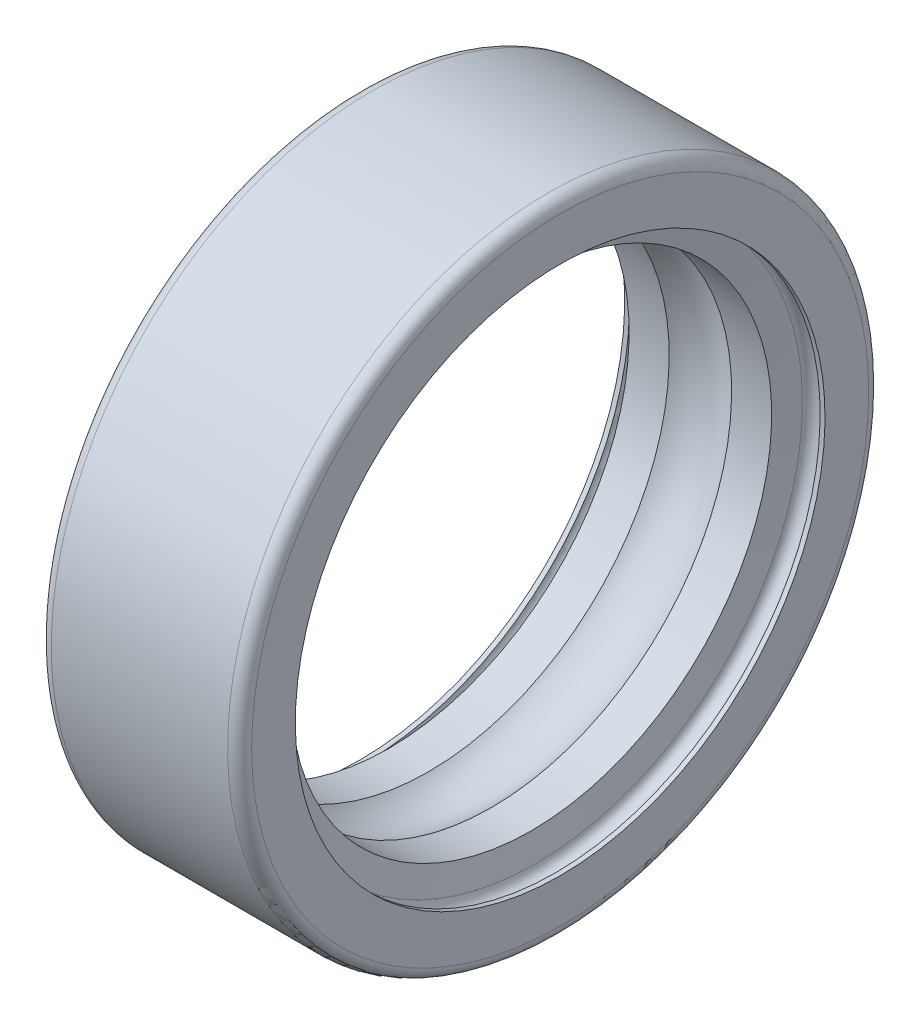
ISO-10303-21;
HEADER;
FILE_DESCRIPTION(('STEP AP214'),'2;1');
FILE_NAME('part.step','',(''),(''),'','','');
FILE_SCHEMA(('AUTOMOTIVE_DESIGN { 1 0 10303 214 1 1 1 1 }'));
ENDSEC;
DATA;
#1=APPLICATION_CONTEXT('core data for automotive mechanical design processes');
#2=APPLICATION_PROTOCOL_DEFINITION('international standard','automotive_design',2000,#1);
#3=PRODUCT_CONTEXT('',#1,'mechanical');
#4=PRODUCT('Part','Part','',(#3));
#5=PRODUCT_RELATED_PRODUCT_CATEGORY('part','',(#4));
#6=PRODUCT_DEFINITION_FORMATION('','',#4);
#7=PRODUCT_DEFINITION_CONTEXT('part definition',#1,'design');
#8=PRODUCT_DEFINITION('design','',#6,#7);
#9=PRODUCT_DEFINITION_SHAPE('','',#8);
#10=(LENGTH_UNIT() NAMED_UNIT(*) SI_UNIT(.MILLI.,.METRE.));
#11=(NAMED_UNIT(*) PLANE_ANGLE_UNIT() SI_UNIT($,.RADIAN.));
#12=(NAMED_UNIT(*) SI_UNIT($,.STERADIAN.) SOLID_ANGLE_UNIT());
#13=UNCERTAINTY_MEASURE_WITH_UNIT(LENGTH_MEASURE(1.E-05),#10,'distance_accuracy_value','');
#14=(GEOMETRIC_REPRESENTATION_CONTEXT(3) GLOBAL_UNCERTAINTY_ASSIGNED_CONTEXT((#13)) GLOBAL_UNIT_ASSIGNED_CONTEXT((#10,
#11,#12)) REPRESENTATION_CONTEXT('',''));
#15=CARTESIAN_POINT('',(0.,0.,0.));
#16=DIRECTION('',(0.,0.,1.));
#17=DIRECTION('',(1.,0.,0.));
#18=AXIS2_PLACEMENT_3D('',#15,#16,#17);
#19=CARTESIAN_POINT('',(5.,7.155,0.));
#20=DIRECTION('',(1.,0.,0.));
#21=DIRECTION('',(0.,1.,0.));
#22=AXIS2_PLACEMENT_3D('',#19,#20,#21);
#23=PLANE('',#22);
#24=CARTESIAN_POINT('',(5.,0.,0.));
#25=DIRECTION('',(1.,0.,0.));
#26=DIRECTION('',(0.,1.,0.));
#27=AXIS2_PLACEMENT_3D('',#24,#25,#26);
#28=CIRCLE('',#27,6.61);
#29=CARTESIAN_POINT('',(5.,-6.61,0.));
#30=VERTEX_POINT('',#29);
#31=EDGE_CURVE('E128',#30,#30,#28,.T.);
#32=ORIENTED_EDGE('',*,*,#31,.F.);
#33=EDGE_LOOP('',(#32));
#34=FACE_BOUND('',#33,.T.);
#35=CARTESIAN_POINT('',(5.,0.,0.));
#36=DIRECTION('',(1.,0.,0.));
#37=DIRECTION('',(0.,1.,0.));
#38=AXIS2_PLACEMENT_3D('',#35,#36,#37);
#39=CIRCLE('',#38,7.7);
#40=CARTESIAN_POINT('',(5.,0.,7.7));
#41=VERTEX_POINT('',#40);
#42=EDGE_CURVE('E125',#41,#41,#39,.T.);
#43=ORIENTED_EDGE('',*,*,#42,.T.);
#44=EDGE_LOOP('',(#43));
#45=FACE_BOUND('',#44,.T.);
#46=ADVANCED_FACE('F16',(#34,#45),#23,.T.);
#47=CARTESIAN_POINT('',(0.,7.155,0.));
#48=DIRECTION('',(-1.,0.,0.));
#49=DIRECTION('',(0.,0.,1.));
#50=AXIS2_PLACEMENT_3D('',#47,#48,#49);
#51=PLANE('',#50);
#52=CARTESIAN_POINT('',(0.,0.,0.));
#53=DIRECTION('',(1.,0.,0.));
#54=DIRECTION('',(0.,1.,0.));
#55=AXIS2_PLACEMENT_3D('',#52,#53,#54);
#56=CIRCLE('',#55,6.61);
#57=CARTESIAN_POINT('',(0.,-6.61,0.));
#58=VERTEX_POINT('',#57);
#59=EDGE_CURVE('E59',#58,#58,#56,.T.);
#60=ORIENTED_EDGE('',*,*,#59,.T.);
#61=EDGE_LOOP('',(#60));
#62=FACE_BOUND('',#61,.T.);
#63=CARTESIAN_POINT('',(0.,0.,0.));
#64=DIRECTION('',(1.,0.,0.));
#65=DIRECTION('',(0.,1.,0.));
#66=AXIS2_PLACEMENT_3D('',#63,#64,#65);
#67=CIRCLE('',#66,7.7);
#68=CARTESIAN_POINT('',(0.,0.,7.7));
#69=VERTEX_POINT('',#68);
#70=EDGE_CURVE('E69',#69,#69,#67,.T.);
#71=ORIENTED_EDGE('',*,*,#70,.F.);
#72=EDGE_LOOP('',(#71));
#73=FACE_BOUND('',#72,.T.);
#74=ADVANCED_FACE('F156',(#62,#73),#51,.T.);
#75=CARTESIAN_POINT('',(4.33619167836637,0.,0.));
#76=DIRECTION('',(1.,0.,0.));
#77=DIRECTION('',(0.,1.,0.));
#78=AXIS2_PLACEMENT_3D('',#75,#76,#77);
#79=CONICAL_SURFACE('',#78,6.32618507767537,1.39626340159546);
#80=CARTESIAN_POINT('',(4.27867644846771,0.,0.));
#81=DIRECTION('',(1.,0.,0.));
#82=DIRECTION('',(0.,1.,0.));
#83=AXIS2_PLACEMENT_3D('',#80,#81,#82);
#84=CIRCLE('',#83,6.);
#85=CARTESIAN_POINT('',(4.27867644846772,-6.,0.));
#86=VERTEX_POINT('',#85);
#87=EDGE_CURVE('E11',#86,#86,#84,.T.);
#88=ORIENTED_EDGE('',*,*,#87,.F.);
#89=EDGE_LOOP('',(#88));
#90=FACE_BOUND('',#89,.T.);
#91=CARTESIAN_POINT('',(4.39370690826502,0.,0.));
#92=DIRECTION('',(1.,0.,0.));
#93=DIRECTION('',(0.,1.,0.));
#94=AXIS2_PLACEMENT_3D('',#91,#92,#93);
#95=CIRCLE('',#94,6.65237015535073);
#96=CARTESIAN_POINT('',(4.39370690826502,6.65237015535073,0.));
#97=VERTEX_POINT('',#96);
#98=EDGE_CURVE('E109',#97,#97,#95,.T.);
#99=ORIENTED_EDGE('',*,*,#98,.T.);
#100=EDGE_LOOP('',(#99));
#101=FACE_BOUND('',#100,.T.);
#102=ADVANCED_FACE('F146',(#90,#101),#79,.F.);
#103=CARTESIAN_POINT('',(3.77898237278481,0.,0.));
#104=DIRECTION('',(1.,0.,0.));
#105=DIRECTION('',(0.,1.,0.));
#106=AXIS2_PLACEMENT_3D('',#103,#104,#105);
#107=CYLINDRICAL_SURFACE('',#106,6.);
#108=CARTESIAN_POINT('',(3.27928829710191,0.,0.));
#109=DIRECTION('',(1.,0.,0.));
#110=DIRECTION('',(0.,1.,0.));
#111=AXIS2_PLACEMENT_3D('',#108,#109,#110);
#112=CIRCLE('',#111,6.);
#113=CARTESIAN_POINT('',(3.27928829710191,-6.,0.));
#114=VERTEX_POINT('',#113);
#115=EDGE_CURVE('E123',#114,#114,#112,.T.);
#116=ORIENTED_EDGE('',*,*,#115,.F.);
#117=EDGE_LOOP('',(#116));
#118=FACE_BOUND('',#117,.T.);
#119=ORIENTED_EDGE('',*,*,#87,.T.);
#120=EDGE_LOOP('',(#119));
#121=FACE_BOUND('',#120,.T.);
#122=ADVANCED_FACE('F143',(#118,#121),#107,.F.);
#123=CARTESIAN_POINT('',(1.22101762721519,0.,0.));
#124=DIRECTION('',(1.,0.,0.));
#125=DIRECTION('',(0.,1.,0.));
#126=AXIS2_PLACEMENT_3D('',#123,#124,#125);
#127=CYLINDRICAL_SURFACE('',#126,6.);
#128=CARTESIAN_POINT('',(0.721323551532286,0.,0.));
#129=DIRECTION('',(1.,0.,0.));
#130=DIRECTION('',(0.,1.,0.));
#131=AXIS2_PLACEMENT_3D('',#128,#129,#130);
#132=CIRCLE('',#131,6.);
#133=CARTESIAN_POINT('',(0.721323551532286,-6.,0.));
#134=VERTEX_POINT('',#133);
#135=EDGE_CURVE('E20',#134,#134,#132,.T.);
#136=ORIENTED_EDGE('',*,*,#135,.F.);
#137=EDGE_LOOP('',(#136));
#138=FACE_BOUND('',#137,.T.);
#139=CARTESIAN_POINT('',(1.72071170289809,0.,0.));
#140=DIRECTION('',(1.,0.,0.));
#141=DIRECTION('',(0.,1.,0.));
#142=AXIS2_PLACEMENT_3D('',#139,#140,#141);
#143=CIRCLE('',#142,6.);
#144=CARTESIAN_POINT('',(1.72071170289809,0.,6.));
#145=VERTEX_POINT('',#144);
#146=EDGE_CURVE('E106',#145,#145,#143,.T.);
#147=ORIENTED_EDGE('',*,*,#146,.T.);
#148=EDGE_LOOP('',(#147));
#149=FACE_BOUND('',#148,.T.);
#150=ADVANCED_FACE('F145',(#138,#149),#127,.F.);
#151=CARTESIAN_POINT('',(0.663808321633632,0.,0.));
#152=DIRECTION('',(-1.,0.,0.));
#153=DIRECTION('',(0.,1.,0.));
#154=AXIS2_PLACEMENT_3D('',#151,#152,#153);
#155=CONICAL_SURFACE('',#154,6.32618507767537,1.39626340159546);
#156=CARTESIAN_POINT('',(0.606293091734979,0.,0.));
#157=DIRECTION('',(1.,0.,0.));
#158=DIRECTION('',(0.,1.,0.));
#159=AXIS2_PLACEMENT_3D('',#156,#157,#158);
#160=CIRCLE('',#159,6.65237015535073);
#161=CARTESIAN_POINT('',(0.606293091734979,-6.65237015535073,0.));
#162=VERTEX_POINT('',#161);
#163=EDGE_CURVE('E101',#162,#162,#160,.T.);
#164=ORIENTED_EDGE('',*,*,#163,.F.);
#165=EDGE_LOOP('',(#164));
#166=FACE_BOUND('',#165,.T.);
#167=ORIENTED_EDGE('',*,*,#135,.T.);
#168=EDGE_LOOP('',(#167));
#169=FACE_BOUND('',#168,.T.);
#170=ADVANCED_FACE('F153',(#166,#169),#155,.F.);
#171=CARTESIAN_POINT('',(0.061,0.,0.));
#172=DIRECTION('',(1.,0.,0.));
#173=DIRECTION('',(0.,1.,0.));
#174=AXIS2_PLACEMENT_3D('',#171,#172,#173);
#175=CYLINDRICAL_SURFACE('',#174,6.61);
#176=ORIENTED_EDGE('',*,*,#59,.F.);
#177=EDGE_LOOP('',(#176));
#178=FACE_BOUND('',#177,.T.);
#179=CARTESIAN_POINT('',(0.122,0.,0.));
#180=DIRECTION('',(1.,0.,0.));
#181=DIRECTION('',(0.,1.,0.));
#182=AXIS2_PLACEMENT_3D('',#179,#180,#181);
#183=CIRCLE('',#182,6.61);
#184=CARTESIAN_POINT('',(0.122,0.,6.61));
#185=VERTEX_POINT('',#184);
#186=EDGE_CURVE('E97',#185,#185,#183,.T.);
#187=ORIENTED_EDGE('',*,*,#186,.T.);
#188=EDGE_LOOP('',(#187));
#189=FACE_BOUND('',#188,.T.);
#190=ADVANCED_FACE('F98',(#178,#189),#175,.F.);
#191=CARTESIAN_POINT('',(0.3,0.,0.));
#192=DIRECTION('',(1.,0.,0.));
#193=DIRECTION('',(0.,0.,-1.));
#194=AXIS2_PLACEMENT_3D('',#191,#192,#193);
#195=TOROIDAL_SURFACE('',#194,7.7,0.3);
#196=ORIENTED_EDGE('',*,*,#70,.T.);
#197=EDGE_LOOP('',(#196));
#198=FACE_BOUND('',#197,.T.);
#199=CARTESIAN_POINT('',(0.3,0.,0.));
#200=DIRECTION('',(1.,0.,0.));
#201=DIRECTION('',(0.,1.,0.));
#202=AXIS2_PLACEMENT_3D('',#199,#200,#201);
#203=CIRCLE('',#202,8.);
#204=CARTESIAN_POINT('',(0.3,0.,-8.));
#205=VERTEX_POINT('',#204);
#206=EDGE_CURVE('E115',#205,#205,#203,.T.);
#207=ORIENTED_EDGE('',*,*,#206,.F.);
#208=EDGE_LOOP('',(#207));
#209=FACE_BOUND('',#208,.T.);
#210=ADVANCED_FACE('F176',(#198,#209),#195,.T.);
#211=CARTESIAN_POINT('',(2.5,0.,0.));
#212=DIRECTION('',(1.,0.,0.));
#213=DIRECTION('',(0.,1.,0.));
#214=AXIS2_PLACEMENT_3D('',#211,#212,#213);
#215=CYLINDRICAL_SURFACE('',#214,8.);
#216=ORIENTED_EDGE('',*,*,#206,.T.);
#217=EDGE_LOOP('',(#216));
#218=FACE_BOUND('',#217,.T.);
#219=CARTESIAN_POINT('',(4.7,0.,0.));
#220=DIRECTION('',(1.,0.,0.));
#221=DIRECTION('',(0.,1.,0.));
#222=AXIS2_PLACEMENT_3D('',#219,#220,#221);
#223=CIRCLE('',#222,8.);
#224=CARTESIAN_POINT('',(4.7,-8.,0.));
#225=VERTEX_POINT('',#224);
#226=EDGE_CURVE('E119',#225,#225,#223,.T.);
#227=ORIENTED_EDGE('',*,*,#226,.F.);
#228=EDGE_LOOP('',(#227));
#229=FACE_BOUND('',#228,.T.);
#230=ADVANCED_FACE('F197',(#218,#229),#215,.T.);
#231=CARTESIAN_POINT('',(4.7,0.,0.));
#232=DIRECTION('',(1.,0.,0.));
#233=DIRECTION('',(0.,0.,-1.));
#234=AXIS2_PLACEMENT_3D('',#231,#232,#233);
#235=TOROIDAL_SURFACE('',#234,7.7,0.3);
#236=ORIENTED_EDGE('',*,*,#226,.T.);
#237=EDGE_LOOP('',(#236));
#238=FACE_BOUND('',#237,.T.);
#239=ORIENTED_EDGE('',*,*,#42,.F.);
#240=EDGE_LOOP('',(#239));
#241=FACE_BOUND('',#240,.T.);
#242=ADVANCED_FACE('F192',(#238,#241),#235,.T.);
#243=CARTESIAN_POINT('',(4.939,0.,0.));
#244=DIRECTION('',(1.,0.,0.));
#245=DIRECTION('',(0.,1.,0.));
#246=AXIS2_PLACEMENT_3D('',#243,#244,#245);
#247=CYLINDRICAL_SURFACE('',#246,6.61);
#248=CARTESIAN_POINT('',(4.878,0.,0.));
#249=DIRECTION('',(1.,0.,0.));
#250=DIRECTION('',(0.,1.,0.));
#251=AXIS2_PLACEMENT_3D('',#248,#249,#250);
#252=CIRCLE('',#251,6.61);
#253=CARTESIAN_POINT('',(4.878,-6.61,0.));
#254=VERTEX_POINT('',#253);
#255=EDGE_CURVE('E91',#254,#254,#252,.T.);
#256=ORIENTED_EDGE('',*,*,#255,.F.);
#257=EDGE_LOOP('',(#256));
#258=FACE_BOUND('',#257,.T.);
#259=ORIENTED_EDGE('',*,*,#31,.T.);
#260=EDGE_LOOP('',(#259));
#261=FACE_BOUND('',#260,.T.);
#262=ADVANCED_FACE('F185',(#258,#261),#247,.F.);
#263=CARTESIAN_POINT('',(2.5,0.,0.));
#264=DIRECTION('',(1.,0.,0.));
#265=DIRECTION('',(0.,0.,-1.));
#266=AXIS2_PLACEMENT_3D('',#263,#264,#265);
#267=TOROIDAL_SURFACE('',#266,5.1,1.1905);
#268=ORIENTED_EDGE('',*,*,#115,.T.);
#269=EDGE_LOOP('',(#268));
#270=FACE_BOUND('',#269,.T.);
#271=ORIENTED_EDGE('',*,*,#146,.F.);
#272=EDGE_LOOP('',(#271));
#273=FACE_BOUND('',#272,.T.);
#274=ADVANCED_FACE('F140',(#270,#273),#267,.F.);
#275=CARTESIAN_POINT('',(0.366,0.,0.));
#276=DIRECTION('',(1.,0.,0.));
#277=DIRECTION('',(0.,0.,-1.));
#278=AXIS2_PLACEMENT_3D('',#275,#276,#277);
#279=TOROIDAL_SURFACE('',#278,6.61,0.244);
#280=ORIENTED_EDGE('',*,*,#163,.T.);
#281=EDGE_LOOP('',(#280));
#282=FACE_BOUND('',#281,.T.);
#283=ORIENTED_EDGE('',*,*,#186,.F.);
#284=EDGE_LOOP('',(#283));
#285=FACE_BOUND('',#284,.T.);
#286=ADVANCED_FACE('F18',(#282,#285),#279,.F.);
#287=CARTESIAN_POINT('',(4.634,0.,0.));
#288=DIRECTION('',(1.,0.,0.));
#289=DIRECTION('',(0.,0.,-1.));
#290=AXIS2_PLACEMENT_3D('',#287,#288,#289);
#291=TOROIDAL_SURFACE('',#290,6.61,0.244);
#292=ORIENTED_EDGE('',*,*,#255,.T.);
#293=EDGE_LOOP('',(#292));
#294=FACE_BOUND('',#293,.T.);
#295=ORIENTED_EDGE('',*,*,#98,.F.);
#296=EDGE_LOOP('',(#295));
#297=FACE_BOUND('',#296,.T.);
#298=ADVANCED_FACE('F190',(#294,#297),#291,.F.);
#299=CLOSED_SHELL('',(#46,#74,#102,#122,#150,#170,#190,#210,#230,#242,#262,#274,#286,#298));
#300=MANIFOLD_SOLID_BREP('B1',#299);
#301=ADVANCED_BREP_SHAPE_REPRESENTATION('',(#18,#300),#14);
#302=SHAPE_DEFINITION_REPRESENTATION(#9,#301);
ENDSEC;
END-ISO-10303-21;
